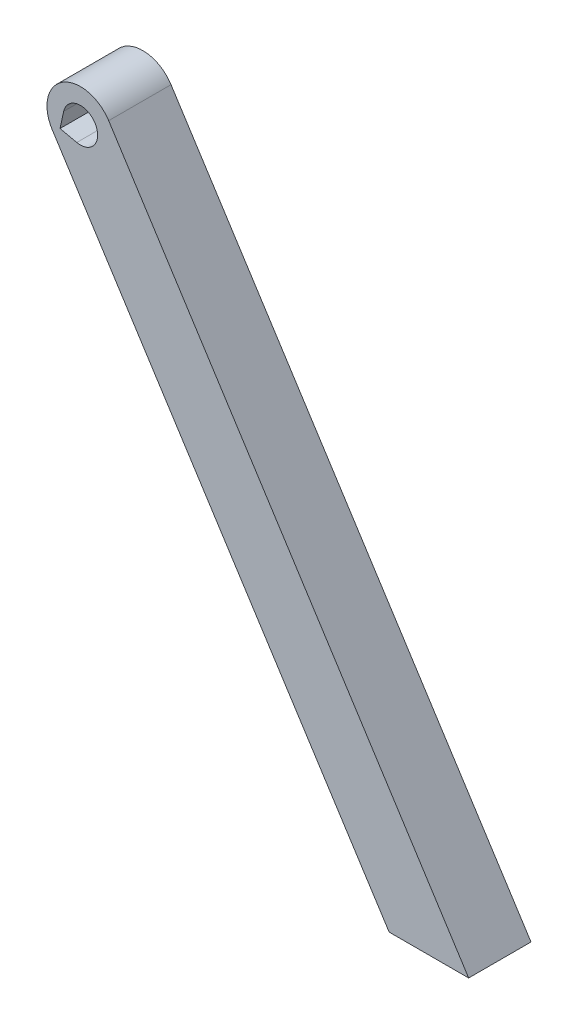
ISO-10303-21;
HEADER;
FILE_DESCRIPTION(('STEP AP214'),'2;1');
FILE_NAME('part.step','',(''),(''),'','','');
FILE_SCHEMA(('AUTOMOTIVE_DESIGN { 1 0 10303 214 1 1 1 1 }'));
ENDSEC;
DATA;
#1=APPLICATION_CONTEXT('core data for automotive mechanical design processes');
#2=APPLICATION_PROTOCOL_DEFINITION('international standard','automotive_design',2000,#1);
#3=PRODUCT_CONTEXT('',#1,'mechanical');
#4=PRODUCT('Part','Part','',(#3));
#5=PRODUCT_RELATED_PRODUCT_CATEGORY('part','',(#4));
#6=PRODUCT_DEFINITION_FORMATION('','',#4);
#7=PRODUCT_DEFINITION_CONTEXT('part definition',#1,'design');
#8=PRODUCT_DEFINITION('design','',#6,#7);
#9=PRODUCT_DEFINITION_SHAPE('','',#8);
#10=(LENGTH_UNIT() NAMED_UNIT(*) SI_UNIT(.MILLI.,.METRE.));
#11=(NAMED_UNIT(*) PLANE_ANGLE_UNIT() SI_UNIT($,.RADIAN.));
#12=(NAMED_UNIT(*) SI_UNIT($,.STERADIAN.) SOLID_ANGLE_UNIT());
#13=UNCERTAINTY_MEASURE_WITH_UNIT(LENGTH_MEASURE(1.E-05),#10,'distance_accuracy_value','');
#14=(GEOMETRIC_REPRESENTATION_CONTEXT(3) GLOBAL_UNCERTAINTY_ASSIGNED_CONTEXT((#13)) GLOBAL_UNIT_ASSIGNED_CONTEXT((#10,
#11,#12)) REPRESENTATION_CONTEXT('',''));
#15=CARTESIAN_POINT('',(0.,0.,0.));
#16=DIRECTION('',(0.,0.,1.));
#17=DIRECTION('',(1.,0.,0.));
#18=AXIS2_PLACEMENT_3D('',#15,#16,#17);
#19=CARTESIAN_POINT('',(-77.3658623606319,52.650989140965,6.9));
#20=DIRECTION('',(0.,0.,1.));
#21=DIRECTION('',(1.,0.,0.));
#22=AXIS2_PLACEMENT_3D('',#19,#20,#21);
#23=PLANE('',#22);
#24=CARTESIAN_POINT('',(-77.3658623606319,52.650989140965,6.9));
#25=DIRECTION('',(0.,0.,1.));
#26=DIRECTION('',(1.,0.,0.));
#27=AXIS2_PLACEMENT_3D('',#24,#25,#26);
#28=CIRCLE('',#27,3.70653324215962);
#29=CARTESIAN_POINT('',(-74.2439305549244,54.6489707414174,6.9));
#30=VERTEX_POINT('',#29);
#31=CARTESIAN_POINT('',(-80.4877941663393,50.6530075405126,6.9));
#32=VERTEX_POINT('',#31);
#33=EDGE_CURVE('E122',#30,#32,#28,.T.);
#34=ORIENTED_EDGE('',*,*,#33,.T.);
#35=DIRECTION('',(0.539043216374417,-0.842278107800935,0.));
#36=VECTOR('',#35,1.);
#37=CARTESIAN_POINT('',(-80.4877941663393,50.6530075405126,6.9));
#38=LINE('',#37,#36);
#39=CARTESIAN_POINT('',(-43.2047843845801,-7.60329172862017,6.9));
#40=VERTEX_POINT('',#39);
#41=EDGE_CURVE('E125',#32,#40,#38,.T.);
#42=ORIENTED_EDGE('',*,*,#41,.T.);
#43=DIRECTION('',(1.,0.,0.));
#44=VECTOR('',#43,1.);
#45=CARTESIAN_POINT('',(-34.4035744093219,-7.60329172862018,6.9));
#46=LINE('',#45,#44);
#47=CARTESIAN_POINT('',(-34.4035744093219,-7.60329172862018,6.9));
#48=VERTEX_POINT('',#47);
#49=EDGE_CURVE('E128',#40,#48,#46,.T.);
#50=ORIENTED_EDGE('',*,*,#49,.T.);
#51=DIRECTION('',(-0.539043216374417,0.842278107800935,0.));
#52=VECTOR('',#51,1.);
#53=CARTESIAN_POINT('',(-74.2439305549244,54.6489707414174,6.9));
#54=LINE('',#53,#52);
#55=EDGE_CURVE('E130',#48,#30,#54,.T.);
#56=ORIENTED_EDGE('',*,*,#55,.T.);
#57=EDGE_LOOP('',(#34,#42,#50,#56));
#58=FACE_BOUND('',#57,.T.);
#59=DIRECTION('',(-0.214419448020058,-0.976741675321973,0.));
#60=VECTOR('',#59,1.);
#61=CARTESIAN_POINT('',(-79.6290684949817,51.2025769090913,6.9));
#62=LINE('',#61,#60);
#63=CARTESIAN_POINT('',(-79.2216715437436,53.0583860922031,6.9));
#64=VERTEX_POINT('',#63);
#65=CARTESIAN_POINT('',(-79.6290684949817,51.2025769090913,6.9));
#66=VERTEX_POINT('',#65);
#67=EDGE_CURVE('E103',#64,#66,#62,.T.);
#68=ORIENTED_EDGE('',*,*,#67,.F.);
#69=CARTESIAN_POINT('',(-77.3658623606319,52.650989140965,6.9));
#70=DIRECTION('',(0.,0.,1.));
#71=DIRECTION('',(1.,0.,0.));
#72=AXIS2_PLACEMENT_3D('',#69,#70,#71);
#73=CIRCLE('',#72,1.89999999999999);
#74=CARTESIAN_POINT('',(-77.77325931187,50.7951799578532,6.9));
#75=VERTEX_POINT('',#74);
#76=EDGE_CURVE('E95',#75,#64,#73,.T.);
#77=ORIENTED_EDGE('',*,*,#76,.F.);
#78=DIRECTION('',(0.976741675321971,-0.214419448020063,0.));
#79=VECTOR('',#78,1.);
#80=CARTESIAN_POINT('',(-77.77325931187,50.7951799578532,6.9));
#81=LINE('',#80,#79);
#82=EDGE_CURVE('E112',#66,#75,#81,.T.);
#83=ORIENTED_EDGE('',*,*,#82,.F.);
#84=EDGE_LOOP('',(#68,#77,#83));
#85=FACE_BOUND('',#84,.T.);
#86=ADVANCED_FACE('F36',(#58,#85),#23,.T.);
#87=CARTESIAN_POINT('',(-77.3658623606319,52.650989140965,0.));
#88=DIRECTION('',(0.,0.,1.));
#89=DIRECTION('',(1.,0.,0.));
#90=AXIS2_PLACEMENT_3D('',#87,#88,#89);
#91=PLANE('',#90);
#92=CARTESIAN_POINT('',(-77.3658623606319,52.650989140965,0.));
#93=DIRECTION('',(0.,0.,1.));
#94=DIRECTION('',(1.,0.,0.));
#95=AXIS2_PLACEMENT_3D('',#92,#93,#94);
#96=CIRCLE('',#95,3.70653324215962);
#97=CARTESIAN_POINT('',(-74.2439305549244,54.6489707414174,0.));
#98=VERTEX_POINT('',#97);
#99=CARTESIAN_POINT('',(-80.4877941663393,50.6530075405126,0.));
#100=VERTEX_POINT('',#99);
#101=EDGE_CURVE('E110',#98,#100,#96,.T.);
#102=ORIENTED_EDGE('',*,*,#101,.F.);
#103=DIRECTION('',(-0.539043216374417,0.842278107800935,0.));
#104=VECTOR('',#103,1.);
#105=CARTESIAN_POINT('',(-74.2439305549244,54.6489707414174,0.));
#106=LINE('',#105,#104);
#107=CARTESIAN_POINT('',(-34.4035744093219,-7.60329172862018,0.));
#108=VERTEX_POINT('',#107);
#109=EDGE_CURVE('E126',#108,#98,#106,.T.);
#110=ORIENTED_EDGE('',*,*,#109,.F.);
#111=DIRECTION('',(1.,0.,0.));
#112=VECTOR('',#111,1.);
#113=CARTESIAN_POINT('',(-34.4035744093219,-7.60329172862018,0.));
#114=LINE('',#113,#112);
#115=CARTESIAN_POINT('',(-43.2047843845801,-7.60329172862017,0.));
#116=VERTEX_POINT('',#115);
#117=EDGE_CURVE('E137',#116,#108,#114,.T.);
#118=ORIENTED_EDGE('',*,*,#117,.F.);
#119=DIRECTION('',(0.539043216374417,-0.842278107800935,0.));
#120=VECTOR('',#119,1.);
#121=CARTESIAN_POINT('',(-80.4877941663393,50.6530075405126,0.));
#122=LINE('',#121,#120);
#123=EDGE_CURVE('E135',#100,#116,#122,.T.);
#124=ORIENTED_EDGE('',*,*,#123,.F.);
#125=EDGE_LOOP('',(#102,#110,#118,#124));
#126=FACE_BOUND('',#125,.T.);
#127=CARTESIAN_POINT('',(-77.3658623606319,52.650989140965,0.));
#128=DIRECTION('',(0.,0.,1.));
#129=DIRECTION('',(1.,0.,0.));
#130=AXIS2_PLACEMENT_3D('',#127,#128,#129);
#131=CIRCLE('',#130,1.89999999999999);
#132=CARTESIAN_POINT('',(-77.77325931187,50.7951799578532,0.));
#133=VERTEX_POINT('',#132);
#134=CARTESIAN_POINT('',(-79.2216715437436,53.0583860922031,0.));
#135=VERTEX_POINT('',#134);
#136=EDGE_CURVE('E59',#133,#135,#131,.T.);
#137=ORIENTED_EDGE('',*,*,#136,.T.);
#138=DIRECTION('',(-0.214419448020058,-0.976741675321973,0.));
#139=VECTOR('',#138,1.);
#140=CARTESIAN_POINT('',(-79.6290684949817,51.2025769090913,0.));
#141=LINE('',#140,#139);
#142=CARTESIAN_POINT('',(-79.6290684949817,51.2025769090913,0.));
#143=VERTEX_POINT('',#142);
#144=EDGE_CURVE('E109',#135,#143,#141,.T.);
#145=ORIENTED_EDGE('',*,*,#144,.T.);
#146=DIRECTION('',(0.976741675321971,-0.214419448020063,0.));
#147=VECTOR('',#146,1.);
#148=CARTESIAN_POINT('',(-77.77325931187,50.7951799578532,0.));
#149=LINE('',#148,#147);
#150=EDGE_CURVE('E104',#143,#133,#149,.T.);
#151=ORIENTED_EDGE('',*,*,#150,.T.);
#152=EDGE_LOOP('',(#137,#145,#151));
#153=FACE_BOUND('',#152,.T.);
#154=ADVANCED_FACE('F155',(#126,#153),#91,.F.);
#155=CARTESIAN_POINT('',(-77.3658623606319,52.650989140965,6.9));
#156=DIRECTION('',(0.,0.,-1.));
#157=DIRECTION('',(-1.,0.,0.));
#158=AXIS2_PLACEMENT_3D('',#155,#156,#157);
#159=CYLINDRICAL_SURFACE('',#158,3.70653324215962);
#160=ORIENTED_EDGE('',*,*,#101,.T.);
#161=DIRECTION('',(0.,0.,-1.));
#162=VECTOR('',#161,1.);
#163=CARTESIAN_POINT('',(-80.4877941663393,50.6530075405126,6.9));
#164=LINE('',#163,#162);
#165=EDGE_CURVE('E11',#32,#100,#164,.T.);
#166=ORIENTED_EDGE('',*,*,#165,.F.);
#167=ORIENTED_EDGE('',*,*,#33,.F.);
#168=DIRECTION('',(0.,0.,-1.));
#169=VECTOR('',#168,1.);
#170=CARTESIAN_POINT('',(-74.2439305549244,54.6489707414174,6.9));
#171=LINE('',#170,#169);
#172=EDGE_CURVE('E132',#30,#98,#171,.T.);
#173=ORIENTED_EDGE('',*,*,#172,.T.);
#174=EDGE_LOOP('',(#160,#166,#167,#173));
#175=FACE_BOUND('',#174,.T.);
#176=ADVANCED_FACE('F38',(#175),#159,.T.);
#177=CARTESIAN_POINT('',(-80.4877941663393,50.6530075405126,6.9));
#178=DIRECTION('',(0.842278107800935,0.539043216374417,0.));
#179=DIRECTION('',(-0.539043216374417,0.842278107800935,0.));
#180=AXIS2_PLACEMENT_3D('',#177,#178,#179);
#181=PLANE('',#180);
#182=ORIENTED_EDGE('',*,*,#123,.T.);
#183=DIRECTION('',(0.,0.,-1.));
#184=VECTOR('',#183,1.);
#185=CARTESIAN_POINT('',(-43.2047843845801,-7.60329172862017,6.9));
#186=LINE('',#185,#184);
#187=EDGE_CURVE('E44',#40,#116,#186,.T.);
#188=ORIENTED_EDGE('',*,*,#187,.F.);
#189=ORIENTED_EDGE('',*,*,#41,.F.);
#190=ORIENTED_EDGE('',*,*,#165,.T.);
#191=EDGE_LOOP('',(#182,#188,#189,#190));
#192=FACE_BOUND('',#191,.T.);
#193=ADVANCED_FACE('F165',(#192),#181,.F.);
#194=CARTESIAN_POINT('',(-34.4035744093219,-7.60329172862018,6.9));
#195=DIRECTION('',(0.,1.,0.));
#196=DIRECTION('',(-1.,0.,0.));
#197=AXIS2_PLACEMENT_3D('',#194,#195,#196);
#198=PLANE('',#197);
#199=ORIENTED_EDGE('',*,*,#117,.T.);
#200=DIRECTION('',(0.,0.,-1.));
#201=VECTOR('',#200,1.);
#202=CARTESIAN_POINT('',(-34.4035744093219,-7.60329172862018,6.9));
#203=LINE('',#202,#201);
#204=EDGE_CURVE('E142',#48,#108,#203,.T.);
#205=ORIENTED_EDGE('',*,*,#204,.F.);
#206=ORIENTED_EDGE('',*,*,#49,.F.);
#207=ORIENTED_EDGE('',*,*,#187,.T.);
#208=EDGE_LOOP('',(#199,#205,#206,#207));
#209=FACE_BOUND('',#208,.T.);
#210=ADVANCED_FACE('F149',(#209),#198,.F.);
#211=CARTESIAN_POINT('',(-74.2439305549244,54.6489707414174,6.9));
#212=DIRECTION('',(-0.842278107800935,-0.539043216374417,0.));
#213=DIRECTION('',(0.539043216374417,-0.842278107800935,0.));
#214=AXIS2_PLACEMENT_3D('',#211,#212,#213);
#215=PLANE('',#214);
#216=ORIENTED_EDGE('',*,*,#109,.T.);
#217=ORIENTED_EDGE('',*,*,#172,.F.);
#218=ORIENTED_EDGE('',*,*,#55,.F.);
#219=ORIENTED_EDGE('',*,*,#204,.T.);
#220=EDGE_LOOP('',(#216,#217,#218,#219));
#221=FACE_BOUND('',#220,.T.);
#222=ADVANCED_FACE('F159',(#221),#215,.F.);
#223=CARTESIAN_POINT('',(-77.3658623606319,52.650989140965,6.9));
#224=DIRECTION('',(0.,0.,-1.));
#225=DIRECTION('',(-1.,0.,0.));
#226=AXIS2_PLACEMENT_3D('',#223,#224,#225);
#227=CYLINDRICAL_SURFACE('',#226,1.89999999999999);
#228=ORIENTED_EDGE('',*,*,#136,.F.);
#229=DIRECTION('',(0.,0.,-1.));
#230=VECTOR('',#229,1.);
#231=CARTESIAN_POINT('',(-77.77325931187,50.7951799578532,6.9));
#232=LINE('',#231,#230);
#233=EDGE_CURVE('E99',#75,#133,#232,.T.);
#234=ORIENTED_EDGE('',*,*,#233,.F.);
#235=ORIENTED_EDGE('',*,*,#76,.T.);
#236=DIRECTION('',(0.,0.,-1.));
#237=VECTOR('',#236,1.);
#238=CARTESIAN_POINT('',(-79.2216715437436,53.0583860922031,6.9));
#239=LINE('',#238,#237);
#240=EDGE_CURVE('E98',#64,#135,#239,.T.);
#241=ORIENTED_EDGE('',*,*,#240,.T.);
#242=EDGE_LOOP('',(#228,#234,#235,#241));
#243=FACE_BOUND('',#242,.T.);
#244=ADVANCED_FACE('F97',(#243),#227,.F.);
#245=CARTESIAN_POINT('',(-79.6290684949817,51.2025769090913,6.9));
#246=DIRECTION('',(0.976741675321973,-0.214419448020058,0.));
#247=DIRECTION('',(0.214419448020058,0.976741675321973,0.));
#248=AXIS2_PLACEMENT_3D('',#245,#246,#247);
#249=PLANE('',#248);
#250=ORIENTED_EDGE('',*,*,#144,.F.);
#251=ORIENTED_EDGE('',*,*,#240,.F.);
#252=ORIENTED_EDGE('',*,*,#67,.T.);
#253=DIRECTION('',(0.,0.,-1.));
#254=VECTOR('',#253,1.);
#255=CARTESIAN_POINT('',(-79.6290684949817,51.2025769090913,6.9));
#256=LINE('',#255,#254);
#257=EDGE_CURVE('E51',#66,#143,#256,.T.);
#258=ORIENTED_EDGE('',*,*,#257,.T.);
#259=EDGE_LOOP('',(#250,#251,#252,#258));
#260=FACE_BOUND('',#259,.T.);
#261=ADVANCED_FACE('F107',(#260),#249,.T.);
#262=CARTESIAN_POINT('',(-77.77325931187,50.7951799578532,6.9));
#263=DIRECTION('',(0.214419448020063,0.976741675321971,0.));
#264=DIRECTION('',(-0.976741675321971,0.214419448020063,0.));
#265=AXIS2_PLACEMENT_3D('',#262,#263,#264);
#266=PLANE('',#265);
#267=ORIENTED_EDGE('',*,*,#150,.F.);
#268=ORIENTED_EDGE('',*,*,#257,.F.);
#269=ORIENTED_EDGE('',*,*,#82,.T.);
#270=ORIENTED_EDGE('',*,*,#233,.T.);
#271=EDGE_LOOP('',(#267,#268,#269,#270));
#272=FACE_BOUND('',#271,.T.);
#273=ADVANCED_FACE('F188',(#272),#266,.T.);
#274=CLOSED_SHELL('',(#86,#154,#176,#193,#210,#222,#244,#261,#273));
#275=MANIFOLD_SOLID_BREP('B2',#274);
#276=ADVANCED_BREP_SHAPE_REPRESENTATION('',(#18,#275),#14);
#277=SHAPE_DEFINITION_REPRESENTATION(#9,#276);
ENDSEC;
END-ISO-10303-21;
